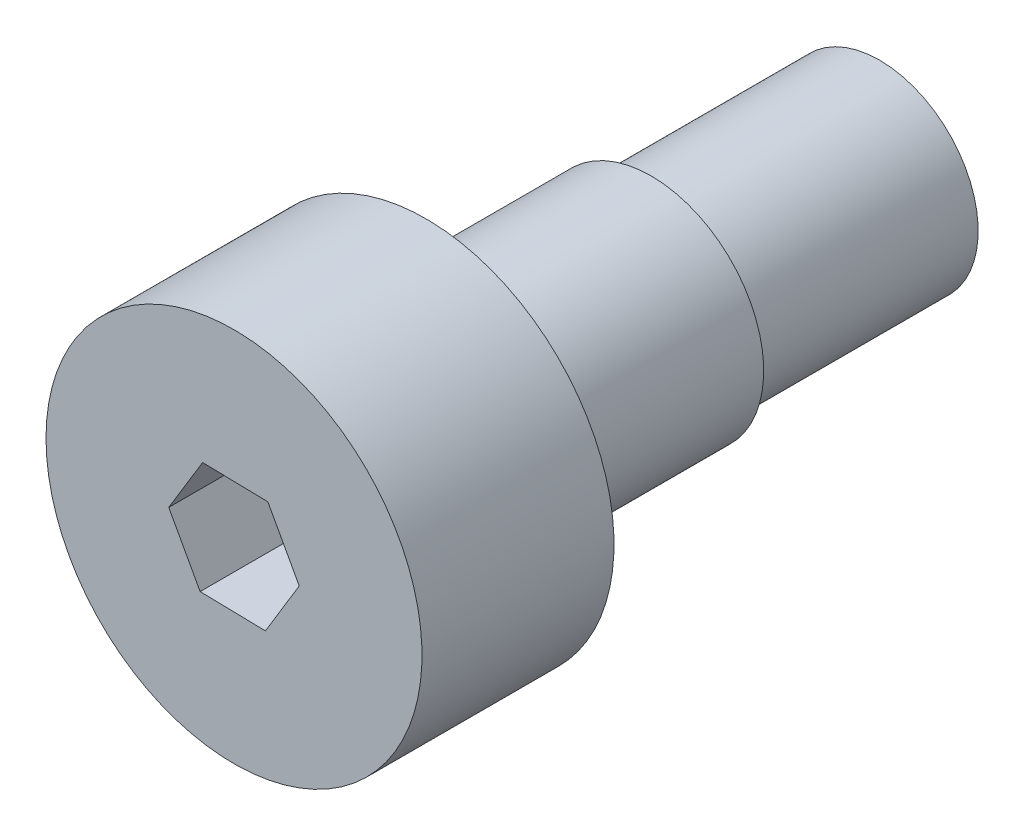
ISO-10303-21;
HEADER;
FILE_DESCRIPTION(('STEP AP214'),'2;1');
FILE_NAME('part.step','',(''),(''),'','','');
FILE_SCHEMA(('AUTOMOTIVE_DESIGN { 1 0 10303 214 1 1 1 1 }'));
ENDSEC;
DATA;
#1=APPLICATION_CONTEXT('core data for automotive mechanical design processes');
#2=APPLICATION_PROTOCOL_DEFINITION('international standard','automotive_design',2000,#1);
#3=PRODUCT_CONTEXT('',#1,'mechanical');
#4=PRODUCT('Part','Part','',(#3));
#5=PRODUCT_RELATED_PRODUCT_CATEGORY('part','',(#4));
#6=PRODUCT_DEFINITION_FORMATION('','',#4);
#7=PRODUCT_DEFINITION_CONTEXT('part definition',#1,'design');
#8=PRODUCT_DEFINITION('design','',#6,#7);
#9=PRODUCT_DEFINITION_SHAPE('','',#8);
#10=(LENGTH_UNIT() NAMED_UNIT(*) SI_UNIT(.MILLI.,.METRE.));
#11=(NAMED_UNIT(*) PLANE_ANGLE_UNIT() SI_UNIT($,.RADIAN.));
#12=(NAMED_UNIT(*) SI_UNIT($,.STERADIAN.) SOLID_ANGLE_UNIT());
#13=UNCERTAINTY_MEASURE_WITH_UNIT(LENGTH_MEASURE(1.E-05),#10,'distance_accuracy_value','');
#14=(GEOMETRIC_REPRESENTATION_CONTEXT(3) GLOBAL_UNCERTAINTY_ASSIGNED_CONTEXT((#13)) GLOBAL_UNIT_ASSIGNED_CONTEXT((#10,
#11,#12)) REPRESENTATION_CONTEXT('',''));
#15=CARTESIAN_POINT('',(0.,0.,0.));
#16=DIRECTION('',(0.,0.,1.));
#17=DIRECTION('',(1.,0.,0.));
#18=AXIS2_PLACEMENT_3D('',#15,#16,#17);
#19=CARTESIAN_POINT('',(-0.663850947,1.209683948,2.06));
#20=DIRECTION('',(-0.854976338719017,0.518667003221359,0.));
#21=DIRECTION('',(-0.518667003221359,-0.854976338719017,0.));
#22=AXIS2_PLACEMENT_3D('',#19,#20,#21);
#23=PLANE('',#22);
#24=DIRECTION('',(0.,0.,-1.));
#25=VECTOR('',#24,1.);
#26=CARTESIAN_POINT('',(-1.379542503,0.02993019,3.06));
#27=LINE('',#26,#25);
#28=CARTESIAN_POINT('',(-1.37954250203602,0.0299301893206676,4.06));
#29=VERTEX_POINT('',#28);
#30=CARTESIAN_POINT('',(-1.37954250281446,0.0299301893999306,2.06));
#31=VERTEX_POINT('',#30);
#32=EDGE_CURVE('E87',#29,#31,#27,.T.);
#33=ORIENTED_EDGE('',*,*,#32,.T.);
#34=DIRECTION('',(-0.518667003221359,-0.854976338719017,0.));
#35=VECTOR('',#34,1.);
#36=CARTESIAN_POINT('',(-1.021696725,0.619807069,2.06));
#37=LINE('',#36,#35);
#38=CARTESIAN_POINT('',(-0.663850947,1.209683948,2.06));
#39=VERTEX_POINT('',#38);
#40=EDGE_CURVE('E58',#39,#31,#37,.T.);
#41=ORIENTED_EDGE('',*,*,#40,.F.);
#42=DIRECTION('',(0.,0.,1.));
#43=VECTOR('',#42,1.);
#44=CARTESIAN_POINT('',(-0.663850947,1.209683948,3.06));
#45=LINE('',#44,#43);
#46=CARTESIAN_POINT('',(-0.663850946605404,1.20968394640876,4.06));
#47=VERTEX_POINT('',#46);
#48=EDGE_CURVE('E96',#39,#47,#45,.T.);
#49=ORIENTED_EDGE('',*,*,#48,.T.);
#50=DIRECTION('',(0.518667003221359,0.854976338719017,0.));
#51=VECTOR('',#50,1.);
#52=CARTESIAN_POINT('',(-1.021696725,0.619807069,4.06));
#53=LINE('',#52,#51);
#54=EDGE_CURVE('E76',#29,#47,#53,.T.);
#55=ORIENTED_EDGE('',*,*,#54,.F.);
#56=EDGE_LOOP('',(#33,#41,#49,#55));
#57=FACE_BOUND('',#56,.T.);
#58=ADVANCED_FACE('F17',(#57),#23,.F.);
#59=CARTESIAN_POINT('',(-1.379542503,0.02993019,2.06));
#60=DIRECTION('',(-0.87666697018193,-0.481097727485836,0.));
#61=DIRECTION('',(0.481097727485836,-0.87666697018193,0.));
#62=AXIS2_PLACEMENT_3D('',#59,#60,#61);
#63=PLANE('',#62);
#64=DIRECTION('',(0.,0.,-1.));
#65=VECTOR('',#64,1.);
#66=CARTESIAN_POINT('',(-0.715691556,-1.179753758,3.06));
#67=LINE('',#66,#65);
#68=CARTESIAN_POINT('',(-0.71569155543062,-1.17975375909944,4.06));
#69=VERTEX_POINT('',#68);
#70=CARTESIAN_POINT('',(-0.715691556,-1.179753758,2.06));
#71=VERTEX_POINT('',#70);
#72=EDGE_CURVE('E92',#69,#71,#67,.T.);
#73=ORIENTED_EDGE('',*,*,#72,.T.);
#74=DIRECTION('',(0.481097727485836,-0.876666970181929,0.));
#75=VECTOR('',#74,1.);
#76=CARTESIAN_POINT('',(-1.0476170295,-0.574911784,2.06));
#77=LINE('',#76,#75);
#78=EDGE_CURVE('E83',#31,#71,#77,.T.);
#79=ORIENTED_EDGE('',*,*,#78,.F.);
#80=ORIENTED_EDGE('',*,*,#32,.F.);
#81=DIRECTION('',(-0.481097727485836,0.876666970181929,0.));
#82=VECTOR('',#81,1.);
#83=CARTESIAN_POINT('',(-1.0476170295,-0.574911784,4.06));
#84=LINE('',#83,#82);
#85=EDGE_CURVE('E94',#69,#29,#84,.T.);
#86=ORIENTED_EDGE('',*,*,#85,.F.);
#87=EDGE_LOOP('',(#73,#79,#80,#86));
#88=FACE_BOUND('',#87,.T.);
#89=ADVANCED_FACE('F90',(#88),#63,.F.);
#90=CARTESIAN_POINT('',(0.715691556,1.179753758,2.06));
#91=DIRECTION('',(0.0216906316958417,0.999764730572466,0.));
#92=DIRECTION('',(-0.999764730572466,0.0216906316958418,0.));
#93=AXIS2_PLACEMENT_3D('',#90,#91,#92);
#94=PLANE('',#93);
#95=ORIENTED_EDGE('',*,*,#48,.F.);
#96=DIRECTION('',(-0.999764730572466,0.0216906316958418,0.));
#97=VECTOR('',#96,1.);
#98=CARTESIAN_POINT('',(0.715691556,1.179753758,2.06));
#99=LINE('',#98,#97);
#100=CARTESIAN_POINT('',(0.715691556,1.179753758,2.06));
#101=VERTEX_POINT('',#100);
#102=EDGE_CURVE('E21',#39,#101,#99,.F.);
#103=ORIENTED_EDGE('',*,*,#102,.T.);
#104=DIRECTION('',(0.,0.,1.));
#105=VECTOR('',#104,1.);
#106=CARTESIAN_POINT('',(0.715691556,1.179753758,3.06));
#107=LINE('',#106,#105);
#108=CARTESIAN_POINT('',(0.71569155543062,1.17975375909944,4.06));
#109=VERTEX_POINT('',#108);
#110=EDGE_CURVE('E106',#101,#109,#107,.T.);
#111=ORIENTED_EDGE('',*,*,#110,.T.);
#112=DIRECTION('',(0.999764730572466,-0.0216906316958417,0.));
#113=VECTOR('',#112,1.);
#114=CARTESIAN_POINT('',(0.0259203045000001,1.194718853,4.06));
#115=LINE('',#114,#113);
#116=EDGE_CURVE('E68',#47,#109,#115,.T.);
#117=ORIENTED_EDGE('',*,*,#116,.F.);
#118=EDGE_LOOP('',(#95,#103,#111,#117));
#119=FACE_BOUND('',#118,.T.);
#120=ADVANCED_FACE('F146',(#119),#94,.F.);
#121=CARTESIAN_POINT('',(-0.715691556,-1.179753758,2.06));
#122=DIRECTION('',(-0.0216906316958417,-0.999764730572466,0.));
#123=DIRECTION('',(0.999764730572466,-0.0216906316958418,0.));
#124=AXIS2_PLACEMENT_3D('',#121,#122,#123);
#125=PLANE('',#124);
#126=DIRECTION('',(0.,0.,-1.));
#127=VECTOR('',#126,1.);
#128=CARTESIAN_POINT('',(0.663850947,-1.209683948,3.06));
#129=LINE('',#128,#127);
#130=CARTESIAN_POINT('',(0.663850944315499,-1.20968394794176,4.06));
#131=VERTEX_POINT('',#130);
#132=CARTESIAN_POINT('',(0.663850947,-1.209683948,2.06));
#133=VERTEX_POINT('',#132);
#134=EDGE_CURVE('E105',#131,#133,#129,.T.);
#135=ORIENTED_EDGE('',*,*,#134,.T.);
#136=DIRECTION('',(0.999764730572466,-0.0216906316958418,0.));
#137=VECTOR('',#136,1.);
#138=CARTESIAN_POINT('',(-0.715691556,-1.179753758,2.06));
#139=LINE('',#138,#137);
#140=EDGE_CURVE('E126',#133,#71,#139,.F.);
#141=ORIENTED_EDGE('',*,*,#140,.T.);
#142=ORIENTED_EDGE('',*,*,#72,.F.);
#143=DIRECTION('',(-0.999764730572466,0.0216906316958417,0.));
#144=VECTOR('',#143,1.);
#145=CARTESIAN_POINT('',(-0.0259203045000001,-1.194718853,4.06));
#146=LINE('',#145,#144);
#147=EDGE_CURVE('E103',#131,#69,#146,.T.);
#148=ORIENTED_EDGE('',*,*,#147,.F.);
#149=EDGE_LOOP('',(#135,#141,#142,#148));
#150=FACE_BOUND('',#149,.T.);
#151=ADVANCED_FACE('F144',(#150),#125,.F.);
#152=CARTESIAN_POINT('',(1.379542503,-1.209683948,2.06));
#153=DIRECTION('',(0.,0.,-1.));
#154=DIRECTION('',(-1.,0.,0.));
#155=AXIS2_PLACEMENT_3D('',#152,#153,#154);
#156=PLANE('',#155);
#157=DIRECTION('',(0.518667003221359,0.854976338719017,0.));
#158=VECTOR('',#157,1.);
#159=CARTESIAN_POINT('',(1.021696725,-0.619807069,2.06));
#160=LINE('',#159,#158);
#161=CARTESIAN_POINT('',(1.37954250262892,-0.0299301887998612,2.06));
#162=VERTEX_POINT('',#161);
#163=EDGE_CURVE('E100',#133,#162,#160,.T.);
#164=ORIENTED_EDGE('',*,*,#163,.T.);
#165=DIRECTION('',(-0.481097727485836,0.876666970181929,0.));
#166=VECTOR('',#165,1.);
#167=CARTESIAN_POINT('',(1.0476170295,0.574911784,2.06));
#168=LINE('',#167,#166);
#169=EDGE_CURVE('E127',#162,#101,#168,.T.);
#170=ORIENTED_EDGE('',*,*,#169,.T.);
#171=ORIENTED_EDGE('',*,*,#102,.F.);
#172=ORIENTED_EDGE('',*,*,#40,.T.);
#173=ORIENTED_EDGE('',*,*,#78,.T.);
#174=ORIENTED_EDGE('',*,*,#140,.F.);
#175=EDGE_LOOP('',(#164,#170,#171,#172,#173,#174));
#176=FACE_BOUND('',#175,.T.);
#177=ADVANCED_FACE('F80',(#176),#156,.F.);
#178=CARTESIAN_POINT('',(1.379542503,-0.02993019,2.06));
#179=DIRECTION('',(0.87666697018193,0.481097727485836,0.));
#180=DIRECTION('',(-0.481097727485836,0.87666697018193,0.));
#181=AXIS2_PLACEMENT_3D('',#178,#179,#180);
#182=PLANE('',#181);
#183=ORIENTED_EDGE('',*,*,#110,.F.);
#184=ORIENTED_EDGE('',*,*,#169,.F.);
#185=DIRECTION('',(0.,0.,1.));
#186=VECTOR('',#185,1.);
#187=CARTESIAN_POINT('',(1.379542503,-0.02993019,3.06));
#188=LINE('',#187,#186);
#189=CARTESIAN_POINT('',(1.37954250281018,-0.0299301896541024,4.06));
#190=VERTEX_POINT('',#189);
#191=EDGE_CURVE('E107',#162,#190,#188,.T.);
#192=ORIENTED_EDGE('',*,*,#191,.T.);
#193=DIRECTION('',(0.481097727485836,-0.876666970181929,0.));
#194=VECTOR('',#193,1.);
#195=CARTESIAN_POINT('',(1.0476170295,0.574911784,4.06));
#196=LINE('',#195,#194);
#197=EDGE_CURVE('E36',#109,#190,#196,.T.);
#198=ORIENTED_EDGE('',*,*,#197,.F.);
#199=EDGE_LOOP('',(#183,#184,#192,#198));
#200=FACE_BOUND('',#199,.T.);
#201=ADVANCED_FACE('F139',(#200),#182,.F.);
#202=CARTESIAN_POINT('',(0.663850947,-1.209683948,2.06));
#203=DIRECTION('',(0.854976338719017,-0.518667003221359,0.));
#204=DIRECTION('',(0.518667003221359,0.854976338719017,0.));
#205=AXIS2_PLACEMENT_3D('',#202,#203,#204);
#206=PLANE('',#205);
#207=ORIENTED_EDGE('',*,*,#191,.F.);
#208=ORIENTED_EDGE('',*,*,#163,.F.);
#209=ORIENTED_EDGE('',*,*,#134,.F.);
#210=DIRECTION('',(-0.518667005679584,-0.854976337227748,0.));
#211=VECTOR('',#210,1.);
#212=CARTESIAN_POINT('',(1.3795425013788,-0.0299301913548001,4.06));
#213=LINE('',#212,#211);
#214=EDGE_CURVE('E109',#190,#131,#213,.T.);
#215=ORIENTED_EDGE('',*,*,#214,.F.);
#216=EDGE_LOOP('',(#207,#208,#209,#215));
#217=FACE_BOUND('',#216,.T.);
#218=ADVANCED_FACE('F141',(#217),#206,.F.);
#219=CARTESIAN_POINT('',(-4.0227,-4.0227,4.06));
#220=DIRECTION('',(0.,0.,1.));
#221=DIRECTION('',(1.,0.,0.));
#222=AXIS2_PLACEMENT_3D('',#219,#220,#221);
#223=PLANE('',#222);
#224=ORIENTED_EDGE('',*,*,#197,.T.);
#225=ORIENTED_EDGE('',*,*,#214,.T.);
#226=ORIENTED_EDGE('',*,*,#147,.T.);
#227=ORIENTED_EDGE('',*,*,#85,.T.);
#228=ORIENTED_EDGE('',*,*,#54,.T.);
#229=ORIENTED_EDGE('',*,*,#116,.T.);
#230=EDGE_LOOP('',(#224,#225,#226,#227,#228,#229));
#231=FACE_BOUND('',#230,.T.);
#232=CARTESIAN_POINT('',(0.,0.,4.06));
#233=DIRECTION('',(0.,0.,-1.));
#234=DIRECTION('',(-1.,0.,0.));
#235=AXIS2_PLACEMENT_3D('',#232,#233,#234);
#236=CIRCLE('',#235,3.975);
#237=CARTESIAN_POINT('',(-3.975,0.,4.06));
#238=VERTEX_POINT('',#237);
#239=EDGE_CURVE('E123',#238,#238,#236,.F.);
#240=ORIENTED_EDGE('',*,*,#239,.T.);
#241=EDGE_LOOP('',(#240));
#242=FACE_BOUND('',#241,.T.);
#243=ADVANCED_FACE('F142',(#231,#242),#223,.T.);
#244=CARTESIAN_POINT('',(0.,0.,4.06));
#245=DIRECTION('',(0.,0.,-1.));
#246=DIRECTION('',(-1.,0.,0.));
#247=AXIS2_PLACEMENT_3D('',#244,#245,#246);
#248=CYLINDRICAL_SURFACE('',#247,3.975);
#249=ORIENTED_EDGE('',*,*,#239,.F.);
#250=EDGE_LOOP('',(#249));
#251=FACE_BOUND('',#250,.T.);
#252=CARTESIAN_POINT('',(0.,0.,0.));
#253=DIRECTION('',(0.,0.,-1.));
#254=DIRECTION('',(-1.,0.,0.));
#255=AXIS2_PLACEMENT_3D('',#252,#253,#254);
#256=CIRCLE('',#255,3.975);
#257=CARTESIAN_POINT('',(-3.975,0.,0.));
#258=VERTEX_POINT('',#257);
#259=EDGE_CURVE('E120',#258,#258,#256,.F.);
#260=ORIENTED_EDGE('',*,*,#259,.T.);
#261=EDGE_LOOP('',(#260));
#262=FACE_BOUND('',#261,.T.);
#263=ADVANCED_FACE('F172',(#251,#262),#248,.T.);
#264=CARTESIAN_POINT('',(-4.0227,-4.0227,0.));
#265=DIRECTION('',(0.,0.,1.));
#266=DIRECTION('',(1.,0.,0.));
#267=AXIS2_PLACEMENT_3D('',#264,#265,#266);
#268=PLANE('',#267);
#269=CARTESIAN_POINT('',(0.,0.,0.));
#270=DIRECTION('',(0.,0.,1.));
#271=DIRECTION('',(0.,-1.,0.));
#272=AXIS2_PLACEMENT_3D('',#269,#270,#271);
#273=CIRCLE('',#272,2.38);
#274=CARTESIAN_POINT('',(0.,-2.38,0.));
#275=VERTEX_POINT('',#274);
#276=EDGE_CURVE('E117',#275,#275,#273,.T.);
#277=ORIENTED_EDGE('',*,*,#276,.T.);
#278=EDGE_LOOP('',(#277));
#279=FACE_BOUND('',#278,.T.);
#280=ORIENTED_EDGE('',*,*,#259,.F.);
#281=EDGE_LOOP('',(#280));
#282=FACE_BOUND('',#281,.T.);
#283=ADVANCED_FACE('F170',(#279,#282),#268,.F.);
#284=CARTESIAN_POINT('',(0.,0.,-4.76));
#285=DIRECTION('',(0.,0.,1.));
#286=DIRECTION('',(0.,-1.,0.));
#287=AXIS2_PLACEMENT_3D('',#284,#285,#286);
#288=CYLINDRICAL_SURFACE('',#287,2.38);
#289=ORIENTED_EDGE('',*,*,#276,.F.);
#290=EDGE_LOOP('',(#289));
#291=FACE_BOUND('',#290,.T.);
#292=CARTESIAN_POINT('',(0.,0.,-4.76));
#293=DIRECTION('',(0.,0.,1.));
#294=DIRECTION('',(0.,-1.,0.));
#295=AXIS2_PLACEMENT_3D('',#292,#293,#294);
#296=CIRCLE('',#295,2.38);
#297=CARTESIAN_POINT('',(0.,-2.38,-4.76));
#298=VERTEX_POINT('',#297);
#299=EDGE_CURVE('E114',#298,#298,#296,.F.);
#300=ORIENTED_EDGE('',*,*,#299,.F.);
#301=EDGE_LOOP('',(#300));
#302=FACE_BOUND('',#301,.T.);
#303=ADVANCED_FACE('F167',(#291,#302),#288,.T.);
#304=CARTESIAN_POINT('',(2.40856,-2.40856,-4.76));
#305=DIRECTION('',(0.,0.,-1.));
#306=DIRECTION('',(-1.,0.,0.));
#307=AXIS2_PLACEMENT_3D('',#304,#305,#306);
#308=PLANE('',#307);
#309=CARTESIAN_POINT('',(0.,0.,-4.76));
#310=DIRECTION('',(0.,0.,1.));
#311=DIRECTION('',(0.,-1.,0.));
#312=AXIS2_PLACEMENT_3D('',#309,#310,#311);
#313=CIRCLE('',#312,2.085);
#314=CARTESIAN_POINT('',(0.,-2.085,-4.76));
#315=VERTEX_POINT('',#314);
#316=EDGE_CURVE('E27',#315,#315,#313,.T.);
#317=ORIENTED_EDGE('',*,*,#316,.T.);
#318=EDGE_LOOP('',(#317));
#319=FACE_BOUND('',#318,.T.);
#320=ORIENTED_EDGE('',*,*,#299,.T.);
#321=EDGE_LOOP('',(#320));
#322=FACE_BOUND('',#321,.T.);
#323=ADVANCED_FACE('F162',(#319,#322),#308,.T.);
#324=CARTESIAN_POINT('',(2.11002,-2.11002,-9.59));
#325=DIRECTION('',(0.,0.,-1.));
#326=DIRECTION('',(-1.,0.,0.));
#327=AXIS2_PLACEMENT_3D('',#324,#325,#326);
#328=PLANE('',#327);
#329=CARTESIAN_POINT('',(0.,0.,-9.59));
#330=DIRECTION('',(0.,0.,1.));
#331=DIRECTION('',(0.,-1.,0.));
#332=AXIS2_PLACEMENT_3D('',#329,#330,#331);
#333=CIRCLE('',#332,2.085);
#334=CARTESIAN_POINT('',(0.,-2.085,-9.59));
#335=VERTEX_POINT('',#334);
#336=EDGE_CURVE('E11',#335,#335,#333,.F.);
#337=ORIENTED_EDGE('',*,*,#336,.T.);
#338=EDGE_LOOP('',(#337));
#339=FACE_BOUND('',#338,.T.);
#340=ADVANCED_FACE('F19',(#339),#328,.T.);
#341=CARTESIAN_POINT('',(0.,0.,-9.59));
#342=DIRECTION('',(0.,0.,1.));
#343=DIRECTION('',(0.,-1.,0.));
#344=AXIS2_PLACEMENT_3D('',#341,#342,#343);
#345=CYLINDRICAL_SURFACE('',#344,2.085);
#346=ORIENTED_EDGE('',*,*,#316,.F.);
#347=EDGE_LOOP('',(#346));
#348=FACE_BOUND('',#347,.T.);
#349=ORIENTED_EDGE('',*,*,#336,.F.);
#350=EDGE_LOOP('',(#349));
#351=FACE_BOUND('',#350,.T.);
#352=ADVANCED_FACE('F155',(#348,#351),#345,.T.);
#353=CLOSED_SHELL('',(#58,#89,#120,#151,#177,#201,#218,#243,#263,#283,#303,#323,#340,#352));
#354=MANIFOLD_SOLID_BREP('B1',#353);
#355=ADVANCED_BREP_SHAPE_REPRESENTATION('',(#18,#354),#14);
#356=SHAPE_DEFINITION_REPRESENTATION(#9,#355);
ENDSEC;
END-ISO-10303-21;
